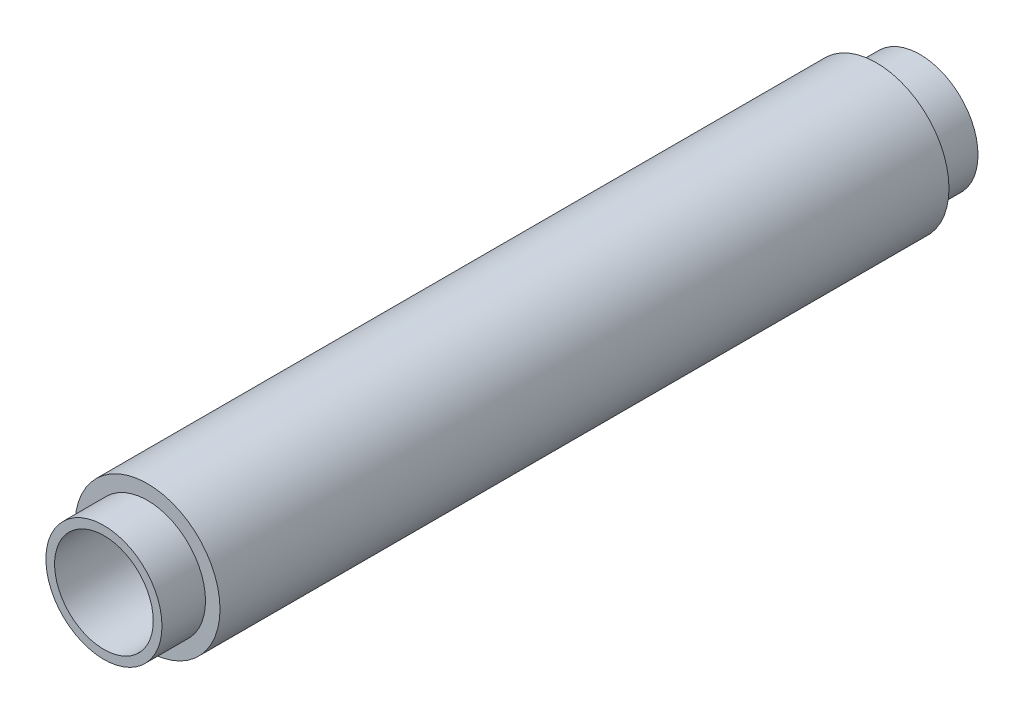
ISO-10303-21;
HEADER;
FILE_DESCRIPTION(('STEP AP214'),'2;1');
FILE_NAME('part.step','',(''),(''),'','','');
FILE_SCHEMA(('AUTOMOTIVE_DESIGN { 1 0 10303 214 1 1 1 1 }'));
ENDSEC;
DATA;
#1=APPLICATION_CONTEXT('core data for automotive mechanical design processes');
#2=APPLICATION_PROTOCOL_DEFINITION('international standard','automotive_design',2000,#1);
#3=PRODUCT_CONTEXT('',#1,'mechanical');
#4=PRODUCT('Part','Part','',(#3));
#5=PRODUCT_RELATED_PRODUCT_CATEGORY('part','',(#4));
#6=PRODUCT_DEFINITION_FORMATION('','',#4);
#7=PRODUCT_DEFINITION_CONTEXT('part definition',#1,'design');
#8=PRODUCT_DEFINITION('design','',#6,#7);
#9=PRODUCT_DEFINITION_SHAPE('','',#8);
#10=(LENGTH_UNIT() NAMED_UNIT(*) SI_UNIT(.MILLI.,.METRE.));
#11=(NAMED_UNIT(*) PLANE_ANGLE_UNIT() SI_UNIT($,.RADIAN.));
#12=(NAMED_UNIT(*) SI_UNIT($,.STERADIAN.) SOLID_ANGLE_UNIT());
#13=UNCERTAINTY_MEASURE_WITH_UNIT(LENGTH_MEASURE(1.E-05),#10,'distance_accuracy_value','');
#14=(GEOMETRIC_REPRESENTATION_CONTEXT(3) GLOBAL_UNCERTAINTY_ASSIGNED_CONTEXT((#13)) GLOBAL_UNIT_ASSIGNED_CONTEXT((#10,
#11,#12)) REPRESENTATION_CONTEXT('',''));
#15=CARTESIAN_POINT('',(0.,0.,0.));
#16=DIRECTION('',(0.,0.,1.));
#17=DIRECTION('',(1.,0.,0.));
#18=AXIS2_PLACEMENT_3D('',#15,#16,#17);
#19=CARTESIAN_POINT('',(3.43024899888577E-12,0.,1000.));
#20=DIRECTION('',(0.,0.,1.));
#21=DIRECTION('',(1.,0.,0.));
#22=AXIS2_PLACEMENT_3D('',#19,#20,#21);
#23=CYLINDRICAL_SURFACE('',#22,25.0000000000002);
#24=CARTESIAN_POINT('',(4.30839274260051E-13,0.,125.6));
#25=DIRECTION('',(0.,0.,1.));
#26=DIRECTION('',(1.,0.,0.));
#27=AXIS2_PLACEMENT_3D('',#24,#25,#26);
#28=CIRCLE('',#27,25.0000000000004);
#29=CARTESIAN_POINT('',(25.0000000000008,0.,125.6));
#30=VERTEX_POINT('',#29);
#31=EDGE_CURVE('E47',#30,#30,#28,.T.);
#32=ORIENTED_EDGE('',*,*,#31,.F.);
#33=EDGE_LOOP('',(#32));
#34=FACE_BOUND('',#33,.T.);
#35=CARTESIAN_POINT('',(-4.30839274260051E-13,0.,-125.6));
#36=DIRECTION('',(0.,0.,1.));
#37=DIRECTION('',(1.,0.,0.));
#38=AXIS2_PLACEMENT_3D('',#35,#36,#37);
#39=CIRCLE('',#38,25.0000000000004);
#40=CARTESIAN_POINT('',(25.,0.,-125.6));
#41=VERTEX_POINT('',#40);
#42=EDGE_CURVE('E61',#41,#41,#39,.T.);
#43=ORIENTED_EDGE('',*,*,#42,.T.);
#44=EDGE_LOOP('',(#43));
#45=FACE_BOUND('',#44,.T.);
#46=ADVANCED_FACE('F33',(#34,#45),#23,.T.);
#47=CARTESIAN_POINT('',(3.43024899888577E-12,0.,1000.));
#48=DIRECTION('',(0.,0.,1.));
#49=DIRECTION('',(1.,0.,0.));
#50=AXIS2_PLACEMENT_3D('',#47,#48,#49);
#51=CYLINDRICAL_SURFACE('',#50,17.0000000000002);
#52=CARTESIAN_POINT('',(4.82293009243338E-13,0.,140.6));
#53=DIRECTION('',(0.,0.,1.));
#54=DIRECTION('',(1.,0.,0.));
#55=AXIS2_PLACEMENT_3D('',#52,#53,#54);
#56=CIRCLE('',#55,17.0000000000005);
#57=CARTESIAN_POINT('',(17.0000000000009,0.,140.6));
#58=VERTEX_POINT('',#57);
#59=EDGE_CURVE('E10',#58,#58,#56,.T.);
#60=ORIENTED_EDGE('',*,*,#59,.T.);
#61=EDGE_LOOP('',(#60));
#62=FACE_BOUND('',#61,.T.);
#63=CARTESIAN_POINT('',(-4.82293009243338E-13,0.,-140.6));
#64=DIRECTION('',(0.,0.,1.));
#65=DIRECTION('',(1.,0.,0.));
#66=AXIS2_PLACEMENT_3D('',#63,#64,#65);
#67=CIRCLE('',#66,17.0000000000005);
#68=CARTESIAN_POINT('',(17.,0.,-140.6));
#69=VERTEX_POINT('',#68);
#70=EDGE_CURVE('E52',#69,#69,#67,.T.);
#71=ORIENTED_EDGE('',*,*,#70,.F.);
#72=EDGE_LOOP('',(#71));
#73=FACE_BOUND('',#72,.T.);
#74=ADVANCED_FACE('F78',(#62,#73),#51,.F.);
#75=CARTESIAN_POINT('',(-20.,0.,140.6));
#76=DIRECTION('',(0.,0.,-1.));
#77=DIRECTION('',(-1.,0.,0.));
#78=AXIS2_PLACEMENT_3D('',#75,#76,#77);
#79=PLANE('',#78);
#80=ORIENTED_EDGE('',*,*,#59,.F.);
#81=EDGE_LOOP('',(#80));
#82=FACE_BOUND('',#81,.T.);
#83=CARTESIAN_POINT('',(4.82293009243338E-13,0.,140.6));
#84=DIRECTION('',(0.,0.,1.));
#85=DIRECTION('',(1.,0.,0.));
#86=AXIS2_PLACEMENT_3D('',#83,#84,#85);
#87=CIRCLE('',#86,20.0000000000005);
#88=CARTESIAN_POINT('',(20.000000000001,0.,140.6));
#89=VERTEX_POINT('',#88);
#90=EDGE_CURVE('E39',#89,#89,#87,.T.);
#91=ORIENTED_EDGE('',*,*,#90,.T.);
#92=EDGE_LOOP('',(#91));
#93=FACE_BOUND('',#92,.T.);
#94=ADVANCED_FACE('F83',(#82,#93),#79,.F.);
#95=CARTESIAN_POINT('',(3.43024899888577E-12,0.,1000.));
#96=DIRECTION('',(0.,0.,1.));
#97=DIRECTION('',(1.,0.,0.));
#98=AXIS2_PLACEMENT_3D('',#95,#96,#97);
#99=CYLINDRICAL_SURFACE('',#98,20.0000000000005);
#100=ORIENTED_EDGE('',*,*,#90,.F.);
#101=EDGE_LOOP('',(#100));
#102=FACE_BOUND('',#101,.T.);
#103=CARTESIAN_POINT('',(4.30839274260051E-13,0.,125.6));
#104=DIRECTION('',(0.,0.,1.));
#105=DIRECTION('',(1.,0.,0.));
#106=AXIS2_PLACEMENT_3D('',#103,#104,#105);
#107=CIRCLE('',#106,20.0000000000004);
#108=CARTESIAN_POINT('',(20.0000000000009,0.,125.6));
#109=VERTEX_POINT('',#108);
#110=EDGE_CURVE('E43',#109,#109,#107,.T.);
#111=ORIENTED_EDGE('',*,*,#110,.T.);
#112=EDGE_LOOP('',(#111));
#113=FACE_BOUND('',#112,.T.);
#114=ADVANCED_FACE('F88',(#102,#113),#99,.T.);
#115=CARTESIAN_POINT('',(-20.,0.,125.6));
#116=DIRECTION('',(0.,0.,-1.));
#117=DIRECTION('',(-1.,0.,0.));
#118=AXIS2_PLACEMENT_3D('',#115,#116,#117);
#119=PLANE('',#118);
#120=ORIENTED_EDGE('',*,*,#110,.F.);
#121=EDGE_LOOP('',(#120));
#122=FACE_BOUND('',#121,.T.);
#123=ORIENTED_EDGE('',*,*,#31,.T.);
#124=EDGE_LOOP('',(#123));
#125=FACE_BOUND('',#124,.T.);
#126=ADVANCED_FACE('F86',(#122,#125),#119,.F.);
#127=CARTESIAN_POINT('',(-20.000000000001,0.,-140.6));
#128=DIRECTION('',(0.,0.,1.));
#129=DIRECTION('',(-1.,0.,0.));
#130=AXIS2_PLACEMENT_3D('',#127,#128,#129);
#131=PLANE('',#130);
#132=ORIENTED_EDGE('',*,*,#70,.T.);
#133=EDGE_LOOP('',(#132));
#134=FACE_BOUND('',#133,.T.);
#135=CARTESIAN_POINT('',(-4.82293009243338E-13,0.,-140.6));
#136=DIRECTION('',(0.,0.,1.));
#137=DIRECTION('',(1.,0.,0.));
#138=AXIS2_PLACEMENT_3D('',#135,#136,#137);
#139=CIRCLE('',#138,20.0000000000005);
#140=CARTESIAN_POINT('',(20.,0.,-140.6));
#141=VERTEX_POINT('',#140);
#142=EDGE_CURVE('E55',#141,#141,#139,.T.);
#143=ORIENTED_EDGE('',*,*,#142,.F.);
#144=EDGE_LOOP('',(#143));
#145=FACE_BOUND('',#144,.T.);
#146=ADVANCED_FACE('F74',(#134,#145),#131,.F.);
#147=CARTESIAN_POINT('',(-3.43024899888577E-12,0.,-1000.));
#148=DIRECTION('',(0.,0.,-1.));
#149=DIRECTION('',(1.,0.,0.));
#150=AXIS2_PLACEMENT_3D('',#147,#148,#149);
#151=CYLINDRICAL_SURFACE('',#150,20.0000000000005);
#152=ORIENTED_EDGE('',*,*,#142,.T.);
#153=EDGE_LOOP('',(#152));
#154=FACE_BOUND('',#153,.T.);
#155=CARTESIAN_POINT('',(-4.30839274260051E-13,0.,-125.6));
#156=DIRECTION('',(0.,0.,1.));
#157=DIRECTION('',(1.,0.,0.));
#158=AXIS2_PLACEMENT_3D('',#155,#156,#157);
#159=CIRCLE('',#158,20.0000000000004);
#160=CARTESIAN_POINT('',(20.,0.,-125.6));
#161=VERTEX_POINT('',#160);
#162=EDGE_CURVE('E58',#161,#161,#159,.T.);
#163=ORIENTED_EDGE('',*,*,#162,.F.);
#164=EDGE_LOOP('',(#163));
#165=FACE_BOUND('',#164,.T.);
#166=ADVANCED_FACE('F68',(#154,#165),#151,.T.);
#167=CARTESIAN_POINT('',(-20.0000000000009,0.,-125.6));
#168=DIRECTION('',(0.,0.,1.));
#169=DIRECTION('',(-1.,0.,0.));
#170=AXIS2_PLACEMENT_3D('',#167,#168,#169);
#171=PLANE('',#170);
#172=ORIENTED_EDGE('',*,*,#162,.T.);
#173=EDGE_LOOP('',(#172));
#174=FACE_BOUND('',#173,.T.);
#175=ORIENTED_EDGE('',*,*,#42,.F.);
#176=EDGE_LOOP('',(#175));
#177=FACE_BOUND('',#176,.T.);
#178=ADVANCED_FACE('F66',(#174,#177),#171,.F.);
#179=CLOSED_SHELL('',(#46,#74,#94,#114,#126,#146,#166,#178));
#180=MANIFOLD_SOLID_BREP('B2',#179);
#181=ADVANCED_BREP_SHAPE_REPRESENTATION('',(#18,#180),#14);
#182=SHAPE_DEFINITION_REPRESENTATION(#9,#181);
ENDSEC;
END-ISO-10303-21;
